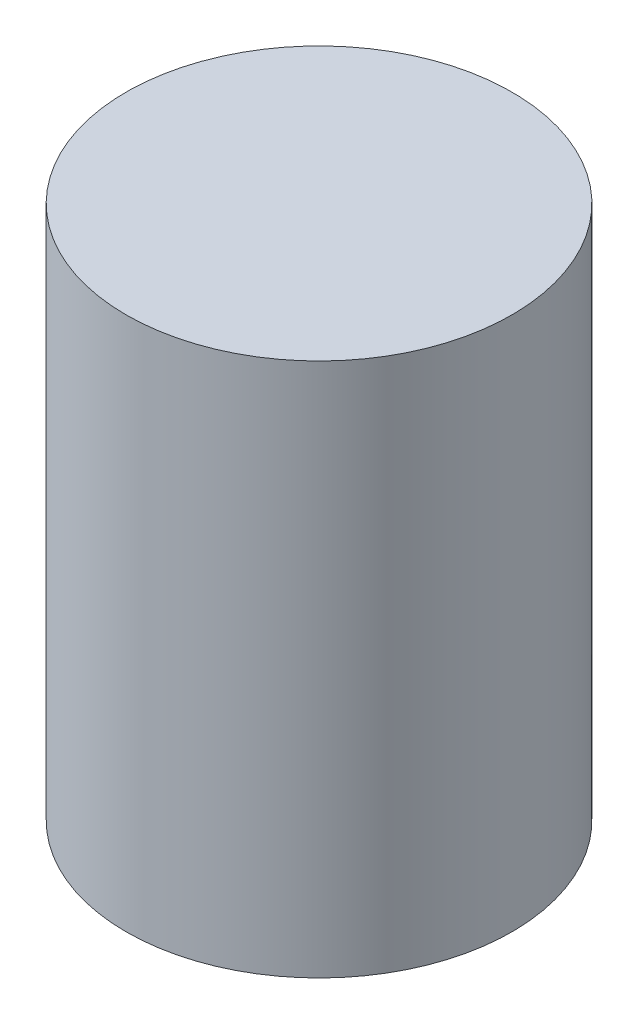
ISO-10303-21;
HEADER;
FILE_DESCRIPTION(('STEP AP214'),'2;1');
FILE_NAME('part.step','',(''),(''),'','','');
FILE_SCHEMA(('AUTOMOTIVE_DESIGN { 1 0 10303 214 1 1 1 1 }'));
ENDSEC;
DATA;
#1=APPLICATION_CONTEXT('core data for automotive mechanical design processes');
#2=APPLICATION_PROTOCOL_DEFINITION('international standard','automotive_design',2000,#1);
#3=PRODUCT_CONTEXT('',#1,'mechanical');
#4=PRODUCT('Part','Part','',(#3));
#5=PRODUCT_RELATED_PRODUCT_CATEGORY('part','',(#4));
#6=PRODUCT_DEFINITION_FORMATION('','',#4);
#7=PRODUCT_DEFINITION_CONTEXT('part definition',#1,'design');
#8=PRODUCT_DEFINITION('design','',#6,#7);
#9=PRODUCT_DEFINITION_SHAPE('','',#8);
#10=(LENGTH_UNIT() NAMED_UNIT(*) SI_UNIT(.MILLI.,.METRE.));
#11=(NAMED_UNIT(*) PLANE_ANGLE_UNIT() SI_UNIT($,.RADIAN.));
#12=(NAMED_UNIT(*) SI_UNIT($,.STERADIAN.) SOLID_ANGLE_UNIT());
#13=UNCERTAINTY_MEASURE_WITH_UNIT(LENGTH_MEASURE(1.E-05),#10,'distance_accuracy_value','');
#14=(GEOMETRIC_REPRESENTATION_CONTEXT(3) GLOBAL_UNCERTAINTY_ASSIGNED_CONTEXT((#13)) GLOBAL_UNIT_ASSIGNED_CONTEXT((#10,
#11,#12)) REPRESENTATION_CONTEXT('',''));
#15=CARTESIAN_POINT('',(0.,0.,0.));
#16=DIRECTION('',(0.,0.,1.));
#17=DIRECTION('',(1.,0.,0.));
#18=AXIS2_PLACEMENT_3D('',#15,#16,#17);
#19=CARTESIAN_POINT('',(0.,18.,0.));
#20=DIRECTION('',(0.,-1.,0.));
#21=DIRECTION('',(0.,0.,-1.));
#22=AXIS2_PLACEMENT_3D('',#19,#20,#21);
#23=CYLINDRICAL_SURFACE('',#22,6.5);
#24=CARTESIAN_POINT('',(0.,18.,0.));
#25=DIRECTION('',(0.,1.,0.));
#26=DIRECTION('',(0.,0.,1.));
#27=AXIS2_PLACEMENT_3D('',#24,#25,#26);
#28=CIRCLE('',#27,6.5);
#29=CARTESIAN_POINT('',(0.,18.,6.5));
#30=VERTEX_POINT('',#29);
#31=EDGE_CURVE('E85',#30,#30,#28,.T.);
#32=ORIENTED_EDGE('',*,*,#31,.F.);
#33=EDGE_LOOP('',(#32));
#34=FACE_BOUND('',#33,.T.);
#35=CARTESIAN_POINT('',(0.,0.,0.));
#36=DIRECTION('',(0.,1.,0.));
#37=DIRECTION('',(0.,0.,1.));
#38=AXIS2_PLACEMENT_3D('',#35,#36,#37);
#39=CIRCLE('',#38,6.5);
#40=CARTESIAN_POINT('',(0.,0.,6.5));
#41=VERTEX_POINT('',#40);
#42=EDGE_CURVE('E84',#41,#41,#39,.T.);
#43=ORIENTED_EDGE('',*,*,#42,.T.);
#44=EDGE_LOOP('',(#43));
#45=FACE_BOUND('',#44,.T.);
#46=ADVANCED_FACE('F35',(#34,#45),#23,.T.);
#47=CARTESIAN_POINT('',(0.,18.,0.));
#48=DIRECTION('',(0.,1.,0.));
#49=DIRECTION('',(0.,0.,1.));
#50=AXIS2_PLACEMENT_3D('',#47,#48,#49);
#51=PLANE('',#50);
#52=ORIENTED_EDGE('',*,*,#31,.T.);
#53=EDGE_LOOP('',(#52));
#54=FACE_BOUND('',#53,.T.);
#55=ADVANCED_FACE('F105',(#54),#51,.T.);
#56=CARTESIAN_POINT('',(0.,0.,0.));
#57=DIRECTION('',(0.,1.,0.));
#58=DIRECTION('',(0.,0.,1.));
#59=AXIS2_PLACEMENT_3D('',#56,#57,#58);
#60=PLANE('',#59);
#61=CARTESIAN_POINT('',(0.,0.,0.));
#62=DIRECTION('',(0.,1.,0.));
#63=DIRECTION('',(0.,0.,1.));
#64=AXIS2_PLACEMENT_3D('',#61,#62,#63);
#65=CIRCLE('',#64,5.57735026918963);
#66=CARTESIAN_POINT('',(0.,0.,5.57735026918963));
#67=VERTEX_POINT('',#66);
#68=EDGE_CURVE('E11',#67,#67,#65,.T.);
#69=ORIENTED_EDGE('',*,*,#68,.T.);
#70=EDGE_LOOP('',(#69));
#71=FACE_BOUND('',#70,.T.);
#72=ORIENTED_EDGE('',*,*,#42,.F.);
#73=EDGE_LOOP('',(#72));
#74=FACE_BOUND('',#73,.T.);
#75=ADVANCED_FACE('F110',(#71,#74),#60,.F.);
#76=CARTESIAN_POINT('',(0.,4.,0.));
#77=DIRECTION('',(0.,-1.,0.));
#78=DIRECTION('',(0.,0.,-1.));
#79=AXIS2_PLACEMENT_3D('',#76,#77,#78);
#80=CYLINDRICAL_SURFACE('',#79,5.);
#81=CARTESIAN_POINT('',(0.,1.00000000000001,0.));
#82=DIRECTION('',(0.,1.,0.));
#83=DIRECTION('',(0.,0.,1.));
#84=AXIS2_PLACEMENT_3D('',#81,#82,#83);
#85=CIRCLE('',#84,5.);
#86=CARTESIAN_POINT('',(0.,1.00000000000001,5.));
#87=VERTEX_POINT('',#86);
#88=EDGE_CURVE('E43',#87,#87,#85,.F.);
#89=ORIENTED_EDGE('',*,*,#88,.T.);
#90=EDGE_LOOP('',(#89));
#91=FACE_BOUND('',#90,.T.);
#92=CARTESIAN_POINT('',(0.,4.,0.));
#93=DIRECTION('',(0.,-1.,0.));
#94=DIRECTION('',(0.,0.,-1.));
#95=AXIS2_PLACEMENT_3D('',#92,#93,#94);
#96=CIRCLE('',#95,5.);
#97=CARTESIAN_POINT('',(0.,4.,-5.));
#98=VERTEX_POINT('',#97);
#99=EDGE_CURVE('E66',#98,#98,#96,.T.);
#100=ORIENTED_EDGE('',*,*,#99,.F.);
#101=EDGE_LOOP('',(#100));
#102=FACE_BOUND('',#101,.T.);
#103=ADVANCED_FACE('F92',(#91,#102),#80,.F.);
#104=CARTESIAN_POINT('',(0.,4.,0.));
#105=DIRECTION('',(0.,-1.,0.));
#106=DIRECTION('',(0.,0.,-1.));
#107=AXIS2_PLACEMENT_3D('',#104,#105,#106);
#108=PLANE('',#107);
#109=CARTESIAN_POINT('',(0.,4.,0.));
#110=DIRECTION('',(0.,-1.,0.));
#111=DIRECTION('',(0.,0.,1.));
#112=AXIS2_PLACEMENT_3D('',#109,#110,#111);
#113=CIRCLE('',#112,3.1);
#114=CARTESIAN_POINT('',(3.04828024000763,4.,-0.563903873349911));
#115=VERTEX_POINT('',#114);
#116=CARTESIAN_POINT('',(-1.73205550705109,4.,-2.57098886043756));
#117=VERTEX_POINT('',#116);
#118=EDGE_CURVE('E50',#115,#117,#113,.T.);
#119=ORIENTED_EDGE('',*,*,#118,.F.);
#120=DIRECTION('',(0.922027274643373,0.,0.387124921457807));
#121=VECTOR('',#120,1.);
#122=CARTESIAN_POINT('',(-1.73205550705109,4.,-2.57098886043756));
#123=LINE('',#122,#121);
#124=EDGE_CURVE('E70',#117,#115,#123,.T.);
#125=ORIENTED_EDGE('',*,*,#124,.F.);
#126=EDGE_LOOP('',(#119,#125));
#127=FACE_BOUND('',#126,.T.);
#128=ORIENTED_EDGE('',*,*,#99,.T.);
#129=EDGE_LOOP('',(#128));
#130=FACE_BOUND('',#129,.T.);
#131=ADVANCED_FACE('F74',(#127,#130),#108,.T.);
#132=CARTESIAN_POINT('',(0.,16.,0.));
#133=DIRECTION('',(0.,-1.,0.));
#134=DIRECTION('',(0.,0.,-1.));
#135=AXIS2_PLACEMENT_3D('',#132,#133,#134);
#136=CYLINDRICAL_SURFACE('',#135,3.1);
#137=ORIENTED_EDGE('',*,*,#118,.T.);
#138=DIRECTION('',(0.,-1.,0.));
#139=VECTOR('',#138,1.);
#140=CARTESIAN_POINT('',(-1.73205550705109,16.,-2.57098886043756));
#141=LINE('',#140,#139);
#142=CARTESIAN_POINT('',(-1.73205550705109,16.,-2.57098886043756));
#143=VERTEX_POINT('',#142);
#144=EDGE_CURVE('E67',#143,#117,#141,.T.);
#145=ORIENTED_EDGE('',*,*,#144,.F.);
#146=CARTESIAN_POINT('',(0.,16.,0.));
#147=DIRECTION('',(0.,-1.,0.));
#148=DIRECTION('',(0.,0.,1.));
#149=AXIS2_PLACEMENT_3D('',#146,#147,#148);
#150=CIRCLE('',#149,3.1);
#151=CARTESIAN_POINT('',(3.04828024000763,16.,-0.563903873349911));
#152=VERTEX_POINT('',#151);
#153=EDGE_CURVE('E64',#152,#143,#150,.T.);
#154=ORIENTED_EDGE('',*,*,#153,.F.);
#155=DIRECTION('',(0.,-1.,0.));
#156=VECTOR('',#155,1.);
#157=CARTESIAN_POINT('',(3.04828024000763,16.,-0.563903873349911));
#158=LINE('',#157,#156);
#159=EDGE_CURVE('E58',#152,#115,#158,.T.);
#160=ORIENTED_EDGE('',*,*,#159,.T.);
#161=EDGE_LOOP('',(#137,#145,#154,#160));
#162=FACE_BOUND('',#161,.T.);
#163=ADVANCED_FACE('F62',(#162),#136,.F.);
#164=CARTESIAN_POINT('',(-1.73205550705109,16.,-2.57098886043756));
#165=DIRECTION('',(0.387124921457807,0.,-0.922027274643373));
#166=DIRECTION('',(-0.922027274643373,0.,-0.387124921457807));
#167=AXIS2_PLACEMENT_3D('',#164,#165,#166);
#168=PLANE('',#167);
#169=ORIENTED_EDGE('',*,*,#124,.T.);
#170=ORIENTED_EDGE('',*,*,#159,.F.);
#171=DIRECTION('',(0.922027274643373,0.,0.387124921457807));
#172=VECTOR('',#171,1.);
#173=CARTESIAN_POINT('',(-1.73205550705109,16.,-2.57098886043756));
#174=LINE('',#173,#172);
#175=EDGE_CURVE('E78',#143,#152,#174,.T.);
#176=ORIENTED_EDGE('',*,*,#175,.F.);
#177=ORIENTED_EDGE('',*,*,#144,.T.);
#178=EDGE_LOOP('',(#169,#170,#176,#177));
#179=FACE_BOUND('',#178,.T.);
#180=ADVANCED_FACE('F71',(#179),#168,.F.);
#181=CARTESIAN_POINT('',(0.,16.,0.));
#182=DIRECTION('',(0.,1.,0.));
#183=DIRECTION('',(0.,0.,1.));
#184=AXIS2_PLACEMENT_3D('',#181,#182,#183);
#185=PLANE('',#184);
#186=ORIENTED_EDGE('',*,*,#153,.T.);
#187=ORIENTED_EDGE('',*,*,#175,.T.);
#188=EDGE_LOOP('',(#186,#187));
#189=FACE_BOUND('',#188,.T.);
#190=ADVANCED_FACE('F96',(#189),#185,.F.);
#191=CARTESIAN_POINT('',(0.,1.00000000000001,0.));
#192=DIRECTION('',(0.,-1.,0.));
#193=DIRECTION('',(0.,0.,-1.));
#194=AXIS2_PLACEMENT_3D('',#191,#192,#193);
#195=CONICAL_SURFACE('',#194,5.,0.523598775598297);
#196=ORIENTED_EDGE('',*,*,#68,.F.);
#197=EDGE_LOOP('',(#196));
#198=FACE_BOUND('',#197,.T.);
#199=ORIENTED_EDGE('',*,*,#88,.F.);
#200=EDGE_LOOP('',(#199));
#201=FACE_BOUND('',#200,.T.);
#202=ADVANCED_FACE('F37',(#198,#201),#195,.F.);
#203=CLOSED_SHELL('',(#46,#55,#75,#103,#131,#163,#180,#190,#202));
#204=MANIFOLD_SOLID_BREP('B2',#203);
#205=ADVANCED_BREP_SHAPE_REPRESENTATION('',(#18,#204),#14);
#206=SHAPE_DEFINITION_REPRESENTATION(#9,#205);
ENDSEC;
END-ISO-10303-21;
